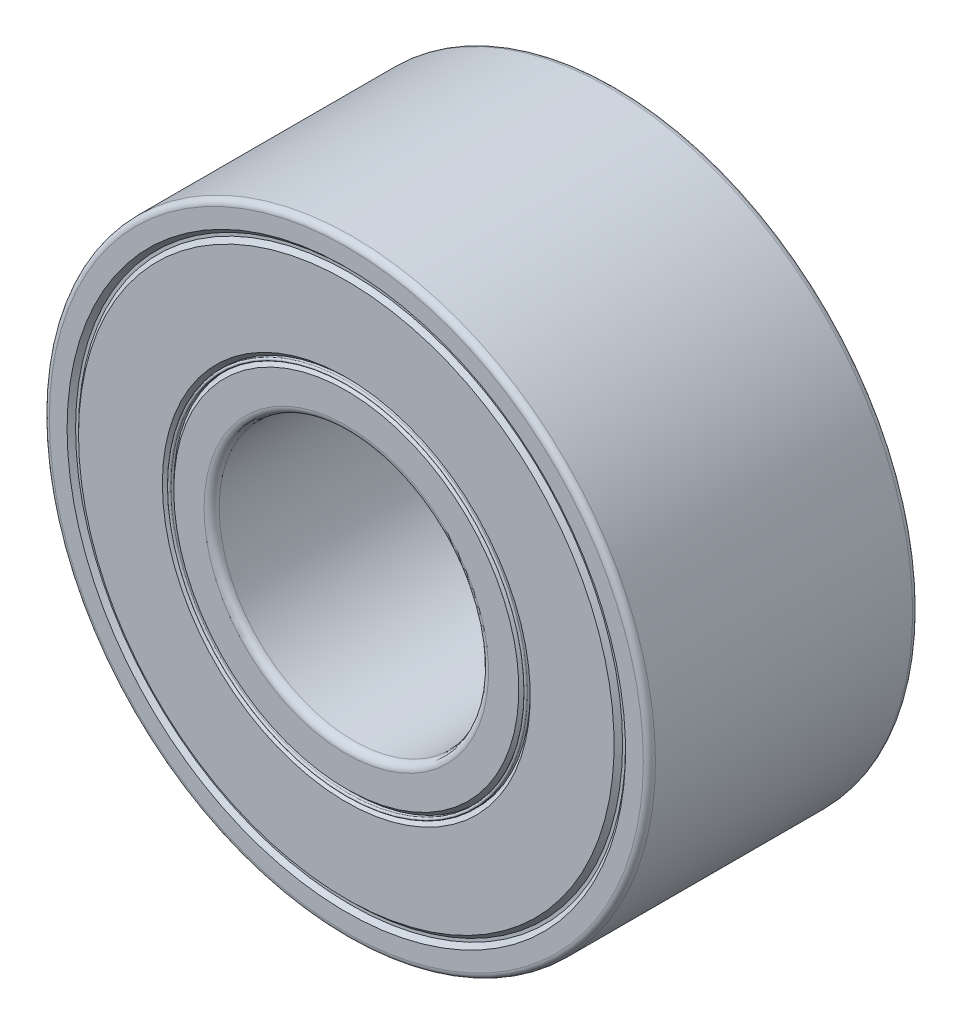
ISO-10303-21;
HEADER;
FILE_DESCRIPTION(('STEP AP214'),'2;1');
FILE_NAME('part.step','',(''),(''),'','','');
FILE_SCHEMA(('AUTOMOTIVE_DESIGN { 1 0 10303 214 1 1 1 1 }'));
ENDSEC;
DATA;
#1=APPLICATION_CONTEXT('core data for automotive mechanical design processes');
#2=APPLICATION_PROTOCOL_DEFINITION('international standard','automotive_design',2000,#1);
#3=PRODUCT_CONTEXT('',#1,'mechanical');
#4=PRODUCT('Part','Part','',(#3));
#5=PRODUCT_RELATED_PRODUCT_CATEGORY('part','',(#4));
#6=PRODUCT_DEFINITION_FORMATION('','',#4);
#7=PRODUCT_DEFINITION_CONTEXT('part definition',#1,'design');
#8=PRODUCT_DEFINITION('design','',#6,#7);
#9=PRODUCT_DEFINITION_SHAPE('','',#8);
#10=(LENGTH_UNIT() NAMED_UNIT(*) SI_UNIT(.MILLI.,.METRE.));
#11=(NAMED_UNIT(*) PLANE_ANGLE_UNIT() SI_UNIT($,.RADIAN.));
#12=(NAMED_UNIT(*) SI_UNIT($,.STERADIAN.) SOLID_ANGLE_UNIT());
#13=UNCERTAINTY_MEASURE_WITH_UNIT(LENGTH_MEASURE(1.E-05),#10,'distance_accuracy_value','');
#14=(GEOMETRIC_REPRESENTATION_CONTEXT(3) GLOBAL_UNCERTAINTY_ASSIGNED_CONTEXT((#13)) GLOBAL_UNIT_ASSIGNED_CONTEXT((#10,
#11,#12)) REPRESENTATION_CONTEXT('',''));
#15=CARTESIAN_POINT('',(0.,0.,0.));
#16=DIRECTION('',(0.,0.,1.));
#17=DIRECTION('',(1.,0.,0.));
#18=AXIS2_PLACEMENT_3D('',#15,#16,#17);
#19=CARTESIAN_POINT('',(0.,0.,-1.978125));
#20=DIRECTION('',(0.,0.,-1.));
#21=DIRECTION('',(-1.,0.,0.));
#22=AXIS2_PLACEMENT_3D('',#19,#20,#21);
#23=TOROIDAL_SURFACE('',#22,2.646875,0.0218749999999998);
#24=CARTESIAN_POINT('',(0.,0.,-1.978125));
#25=DIRECTION('',(0.,0.,-1.));
#26=DIRECTION('',(-1.,0.,0.));
#27=AXIS2_PLACEMENT_3D('',#24,#25,#26);
#28=CIRCLE('',#27,2.625);
#29=CARTESIAN_POINT('',(-2.625,0.,-1.978125));
#30=VERTEX_POINT('',#29);
#31=EDGE_CURVE('E62',#30,#30,#28,.T.);
#32=ORIENTED_EDGE('',*,*,#31,.F.);
#33=EDGE_LOOP('',(#32));
#34=FACE_BOUND('',#33,.T.);
#35=CARTESIAN_POINT('',(0.,0.,-1.978125));
#36=DIRECTION('',(0.,0.,-1.));
#37=DIRECTION('',(-1.,0.,0.));
#38=AXIS2_PLACEMENT_3D('',#35,#36,#37);
#39=CIRCLE('',#38,2.66875);
#40=CARTESIAN_POINT('',(-2.66875,0.,-1.978125));
#41=VERTEX_POINT('',#40);
#42=EDGE_CURVE('E11',#41,#41,#39,.T.);
#43=ORIENTED_EDGE('',*,*,#42,.T.);
#44=EDGE_LOOP('',(#43));
#45=FACE_BOUND('',#44,.T.);
#46=ADVANCED_FACE('F48',(#34,#45),#23,.T.);
#47=CARTESIAN_POINT('',(0.,0.,-2.));
#48=DIRECTION('',(0.,0.,-1.));
#49=DIRECTION('',(-1.,0.,0.));
#50=AXIS2_PLACEMENT_3D('',#47,#48,#49);
#51=CYLINDRICAL_SURFACE('',#50,2.66875);
#52=ORIENTED_EDGE('',*,*,#42,.F.);
#53=EDGE_LOOP('',(#52));
#54=FACE_BOUND('',#53,.T.);
#55=CARTESIAN_POINT('',(0.,0.,-1.937));
#56=DIRECTION('',(0.,0.,-1.));
#57=DIRECTION('',(-1.,0.,0.));
#58=AXIS2_PLACEMENT_3D('',#55,#56,#57);
#59=CIRCLE('',#58,2.66875);
#60=CARTESIAN_POINT('',(-2.66875,0.,-1.937));
#61=VERTEX_POINT('',#60);
#62=EDGE_CURVE('E54',#61,#61,#59,.T.);
#63=ORIENTED_EDGE('',*,*,#62,.T.);
#64=EDGE_LOOP('',(#63));
#65=FACE_BOUND('',#64,.T.);
#66=ADVANCED_FACE('F71',(#54,#65),#51,.T.);
#67=CARTESIAN_POINT('',(0.,-2.66875,-1.937));
#68=DIRECTION('',(0.,0.,-1.));
#69=DIRECTION('',(-1.,0.,0.));
#70=AXIS2_PLACEMENT_3D('',#67,#68,#69);
#71=PLANE('',#70);
#72=ORIENTED_EDGE('',*,*,#62,.F.);
#73=EDGE_LOOP('',(#72));
#74=FACE_BOUND('',#73,.T.);
#75=CARTESIAN_POINT('',(0.,0.,-1.937));
#76=DIRECTION('',(0.,0.,-1.));
#77=DIRECTION('',(-1.,0.,0.));
#78=AXIS2_PLACEMENT_3D('',#75,#76,#77);
#79=CIRCLE('',#78,2.625);
#80=CARTESIAN_POINT('',(-2.625,0.,-1.937));
#81=VERTEX_POINT('',#80);
#82=EDGE_CURVE('E58',#81,#81,#79,.T.);
#83=ORIENTED_EDGE('',*,*,#82,.T.);
#84=EDGE_LOOP('',(#83));
#85=FACE_BOUND('',#84,.T.);
#86=ADVANCED_FACE('F75',(#74,#85),#71,.F.);
#87=CARTESIAN_POINT('',(0.,0.,-2.));
#88=DIRECTION('',(0.,0.,-1.));
#89=DIRECTION('',(-1.,0.,0.));
#90=AXIS2_PLACEMENT_3D('',#87,#88,#89);
#91=CYLINDRICAL_SURFACE('',#90,2.625);
#92=ORIENTED_EDGE('',*,*,#82,.F.);
#93=EDGE_LOOP('',(#92));
#94=FACE_BOUND('',#93,.T.);
#95=ORIENTED_EDGE('',*,*,#31,.T.);
#96=EDGE_LOOP('',(#95));
#97=FACE_BOUND('',#96,.T.);
#98=ADVANCED_FACE('F68',(#94,#97),#91,.F.);
#99=CLOSED_SHELL('',(#46,#66,#86,#98));
#100=MANIFOLD_SOLID_BREP('B2',#99);
#101=CARTESIAN_POINT('',(0.,0.,-2.));
#102=DIRECTION('',(0.,0.,-1.));
#103=DIRECTION('',(-1.,0.,0.));
#104=AXIS2_PLACEMENT_3D('',#101,#102,#103);
#105=CYLINDRICAL_SURFACE('',#104,2.66875);
#106=CARTESIAN_POINT('',(0.,0.,1.937));
#107=DIRECTION('',(0.,0.,-1.));
#108=DIRECTION('',(-1.,0.,0.));
#109=AXIS2_PLACEMENT_3D('',#106,#107,#108);
#110=CIRCLE('',#109,2.66875);
#111=CARTESIAN_POINT('',(-2.66875,0.,1.937));
#112=VERTEX_POINT('',#111);
#113=EDGE_CURVE('E47',#112,#112,#110,.T.);
#114=ORIENTED_EDGE('',*,*,#113,.F.);
#115=EDGE_LOOP('',(#114));
#116=FACE_BOUND('',#115,.T.);
#117=CARTESIAN_POINT('',(0.,0.,1.978125));
#118=DIRECTION('',(0.,0.,-1.));
#119=DIRECTION('',(-1.,0.,0.));
#120=AXIS2_PLACEMENT_3D('',#117,#118,#119);
#121=CIRCLE('',#120,2.66875);
#122=CARTESIAN_POINT('',(-2.66875,0.,1.978125));
#123=VERTEX_POINT('',#122);
#124=EDGE_CURVE('E132',#123,#123,#121,.T.);
#125=ORIENTED_EDGE('',*,*,#124,.T.);
#126=EDGE_LOOP('',(#125));
#127=FACE_BOUND('',#126,.T.);
#128=ADVANCED_FACE('F118',(#116,#127),#105,.T.);
#129=CARTESIAN_POINT('',(0.,-2.66875,1.937));
#130=DIRECTION('',(0.,0.,1.));
#131=DIRECTION('',(1.,0.,0.));
#132=AXIS2_PLACEMENT_3D('',#129,#130,#131);
#133=PLANE('',#132);
#134=CARTESIAN_POINT('',(0.,0.,1.937));
#135=DIRECTION('',(0.,0.,-1.));
#136=DIRECTION('',(-1.,0.,0.));
#137=AXIS2_PLACEMENT_3D('',#134,#135,#136);
#138=CIRCLE('',#137,2.625);
#139=CARTESIAN_POINT('',(-2.625,0.,1.937));
#140=VERTEX_POINT('',#139);
#141=EDGE_CURVE('E124',#140,#140,#138,.T.);
#142=ORIENTED_EDGE('',*,*,#141,.F.);
#143=EDGE_LOOP('',(#142));
#144=FACE_BOUND('',#143,.T.);
#145=ORIENTED_EDGE('',*,*,#113,.T.);
#146=EDGE_LOOP('',(#145));
#147=FACE_BOUND('',#146,.T.);
#148=ADVANCED_FACE('F147',(#144,#147),#133,.F.);
#149=CARTESIAN_POINT('',(0.,0.,-2.));
#150=DIRECTION('',(0.,0.,-1.));
#151=DIRECTION('',(-1.,0.,0.));
#152=AXIS2_PLACEMENT_3D('',#149,#150,#151);
#153=CYLINDRICAL_SURFACE('',#152,2.625);
#154=CARTESIAN_POINT('',(0.,0.,1.978125));
#155=DIRECTION('',(0.,0.,-1.));
#156=DIRECTION('',(-1.,0.,0.));
#157=AXIS2_PLACEMENT_3D('',#154,#155,#156);
#158=CIRCLE('',#157,2.625);
#159=CARTESIAN_POINT('',(-2.625,0.,1.978125));
#160=VERTEX_POINT('',#159);
#161=EDGE_CURVE('E128',#160,#160,#158,.T.);
#162=ORIENTED_EDGE('',*,*,#161,.F.);
#163=EDGE_LOOP('',(#162));
#164=FACE_BOUND('',#163,.T.);
#165=ORIENTED_EDGE('',*,*,#141,.T.);
#166=EDGE_LOOP('',(#165));
#167=FACE_BOUND('',#166,.T.);
#168=ADVANCED_FACE('F142',(#164,#167),#153,.F.);
#169=CARTESIAN_POINT('',(0.,0.,1.978125));
#170=DIRECTION('',(0.,0.,-1.));
#171=DIRECTION('',(-1.,0.,0.));
#172=AXIS2_PLACEMENT_3D('',#169,#170,#171);
#173=TOROIDAL_SURFACE('',#172,2.646875,0.0218749999999998);
#174=ORIENTED_EDGE('',*,*,#124,.F.);
#175=EDGE_LOOP('',(#174));
#176=FACE_BOUND('',#175,.T.);
#177=ORIENTED_EDGE('',*,*,#161,.T.);
#178=EDGE_LOOP('',(#177));
#179=FACE_BOUND('',#178,.T.);
#180=ADVANCED_FACE('F139',(#176,#179),#173,.T.);
#181=CLOSED_SHELL('',(#128,#148,#168,#180));
#182=MANIFOLD_SOLID_BREP('B6',#181);
#183=CARTESIAN_POINT('',(0.,-4.03958333333333,-1.937));
#184=DIRECTION('',(0.,0.,1.));
#185=DIRECTION('',(1.,0.,0.));
#186=AXIS2_PLACEMENT_3D('',#183,#184,#185);
#187=PLANE('',#186);
#188=CARTESIAN_POINT('',(0.,0.,-1.937));
#189=DIRECTION('',(0.,0.,-1.));
#190=DIRECTION('',(-1.,0.,0.));
#191=AXIS2_PLACEMENT_3D('',#188,#189,#190);
#192=CIRCLE('',#191,4.03958333333333);
#193=CARTESIAN_POINT('',(-4.03958333333333,0.,-1.937));
#194=VERTEX_POINT('',#193);
#195=EDGE_CURVE('E216',#194,#194,#192,.T.);
#196=ORIENTED_EDGE('',*,*,#195,.F.);
#197=EDGE_LOOP('',(#196));
#198=FACE_BOUND('',#197,.T.);
#199=CARTESIAN_POINT('',(0.,0.,-1.937));
#200=DIRECTION('',(0.,0.,-1.));
#201=DIRECTION('',(-1.,0.,0.));
#202=AXIS2_PLACEMENT_3D('',#199,#200,#201);
#203=CIRCLE('',#202,4.08333333333333);
#204=CARTESIAN_POINT('',(-4.08333333333333,0.,-1.937));
#205=VERTEX_POINT('',#204);
#206=EDGE_CURVE('E117',#205,#205,#203,.T.);
#207=ORIENTED_EDGE('',*,*,#206,.T.);
#208=EDGE_LOOP('',(#207));
#209=FACE_BOUND('',#208,.T.);
#210=ADVANCED_FACE('F188',(#198,#209),#187,.F.);
#211=CARTESIAN_POINT('',(0.,0.,-2.));
#212=DIRECTION('',(0.,0.,-1.));
#213=DIRECTION('',(-1.,0.,0.));
#214=AXIS2_PLACEMENT_3D('',#211,#212,#213);
#215=CYLINDRICAL_SURFACE('',#214,4.08333333333333);
#216=ORIENTED_EDGE('',*,*,#206,.F.);
#217=EDGE_LOOP('',(#216));
#218=FACE_BOUND('',#217,.T.);
#219=CARTESIAN_POINT('',(0.,0.,-0.875000000000001));
#220=DIRECTION('',(0.,0.,-1.));
#221=DIRECTION('',(-1.,0.,0.));
#222=AXIS2_PLACEMENT_3D('',#219,#220,#221);
#223=CIRCLE('',#222,4.08333333333333);
#224=CARTESIAN_POINT('',(-4.08333333333333,0.,-0.875000000000001));
#225=VERTEX_POINT('',#224);
#226=EDGE_CURVE('E194',#225,#225,#223,.T.);
#227=ORIENTED_EDGE('',*,*,#226,.T.);
#228=EDGE_LOOP('',(#227));
#229=FACE_BOUND('',#228,.T.);
#230=ADVANCED_FACE('F223',(#218,#229),#215,.T.);
#231=CARTESIAN_POINT('',(0.,-4.08333333333333,-0.875000000000001));
#232=DIRECTION('',(0.,0.,-1.));
#233=DIRECTION('',(-1.,0.,0.));
#234=AXIS2_PLACEMENT_3D('',#231,#232,#233);
#235=PLANE('',#234);
#236=ORIENTED_EDGE('',*,*,#226,.F.);
#237=EDGE_LOOP('',(#236));
#238=FACE_BOUND('',#237,.T.);
#239=CARTESIAN_POINT('',(0.,0.,-0.875000000000001));
#240=DIRECTION('',(0.,0.,-1.));
#241=DIRECTION('',(-1.,0.,0.));
#242=AXIS2_PLACEMENT_3D('',#239,#240,#241);
#243=CIRCLE('',#242,2.625);
#244=CARTESIAN_POINT('',(-2.625,0.,-0.875000000000001));
#245=VERTEX_POINT('',#244);
#246=EDGE_CURVE('E198',#245,#245,#243,.T.);
#247=ORIENTED_EDGE('',*,*,#246,.T.);
#248=EDGE_LOOP('',(#247));
#249=FACE_BOUND('',#248,.T.);
#250=ADVANCED_FACE('F227',(#238,#249),#235,.F.);
#251=CARTESIAN_POINT('',(0.,0.,-2.));
#252=DIRECTION('',(0.,0.,-1.));
#253=DIRECTION('',(-1.,0.,0.));
#254=AXIS2_PLACEMENT_3D('',#251,#252,#253);
#255=CYLINDRICAL_SURFACE('',#254,2.625);
#256=ORIENTED_EDGE('',*,*,#246,.F.);
#257=EDGE_LOOP('',(#256));
#258=FACE_BOUND('',#257,.T.);
#259=CARTESIAN_POINT('',(0.,0.,-1.937));
#260=DIRECTION('',(0.,0.,-1.));
#261=DIRECTION('',(-1.,0.,0.));
#262=AXIS2_PLACEMENT_3D('',#259,#260,#261);
#263=CIRCLE('',#262,2.625);
#264=CARTESIAN_POINT('',(-2.625,0.,-1.937));
#265=VERTEX_POINT('',#264);
#266=EDGE_CURVE('E202',#265,#265,#263,.T.);
#267=ORIENTED_EDGE('',*,*,#266,.T.);
#268=EDGE_LOOP('',(#267));
#269=FACE_BOUND('',#268,.T.);
#270=ADVANCED_FACE('F232',(#258,#269),#255,.F.);
#271=CARTESIAN_POINT('',(0.,-2.66875,-1.937));
#272=DIRECTION('',(0.,0.,1.));
#273=DIRECTION('',(1.,0.,0.));
#274=AXIS2_PLACEMENT_3D('',#271,#272,#273);
#275=PLANE('',#274);
#276=ORIENTED_EDGE('',*,*,#266,.F.);
#277=EDGE_LOOP('',(#276));
#278=FACE_BOUND('',#277,.T.);
#279=CARTESIAN_POINT('',(0.,0.,-1.937));
#280=DIRECTION('',(0.,0.,-1.));
#281=DIRECTION('',(-1.,0.,0.));
#282=AXIS2_PLACEMENT_3D('',#279,#280,#281);
#283=CIRCLE('',#282,2.66875);
#284=CARTESIAN_POINT('',(-2.66875,0.,-1.937));
#285=VERTEX_POINT('',#284);
#286=EDGE_CURVE('E207',#285,#285,#283,.T.);
#287=ORIENTED_EDGE('',*,*,#286,.T.);
#288=EDGE_LOOP('',(#287));
#289=FACE_BOUND('',#288,.T.);
#290=ADVANCED_FACE('F238',(#278,#289),#275,.F.);
#291=CARTESIAN_POINT('',(0.,0.,-2.));
#292=DIRECTION('',(0.,0.,-1.));
#293=DIRECTION('',(-1.,0.,0.));
#294=AXIS2_PLACEMENT_3D('',#291,#292,#293);
#295=CONICAL_SURFACE('',#294,2.73175,0.785398163397465);
#296=ORIENTED_EDGE('',*,*,#286,.F.);
#297=EDGE_LOOP('',(#296));
#298=FACE_BOUND('',#297,.T.);
#299=CARTESIAN_POINT('',(0.,0.,-2.));
#300=DIRECTION('',(0.,0.,-1.));
#301=DIRECTION('',(-1.,0.,0.));
#302=AXIS2_PLACEMENT_3D('',#299,#300,#301);
#303=CIRCLE('',#302,2.73175);
#304=CARTESIAN_POINT('',(-2.73175,0.,-2.));
#305=VERTEX_POINT('',#304);
#306=EDGE_CURVE('E210',#305,#305,#303,.T.);
#307=ORIENTED_EDGE('',*,*,#306,.T.);
#308=EDGE_LOOP('',(#307));
#309=FACE_BOUND('',#308,.T.);
#310=ADVANCED_FACE('F242',(#298,#309),#295,.F.);
#311=CARTESIAN_POINT('',(0.,-2.73175,-2.));
#312=DIRECTION('',(0.,0.,1.));
#313=DIRECTION('',(1.,0.,0.));
#314=AXIS2_PLACEMENT_3D('',#311,#312,#313);
#315=PLANE('',#314);
#316=ORIENTED_EDGE('',*,*,#306,.F.);
#317=EDGE_LOOP('',(#316));
#318=FACE_BOUND('',#317,.T.);
#319=CARTESIAN_POINT('',(0.,0.,-2.));
#320=DIRECTION('',(0.,0.,-1.));
#321=DIRECTION('',(-1.,0.,0.));
#322=AXIS2_PLACEMENT_3D('',#319,#320,#321);
#323=CIRCLE('',#322,3.97658333333333);
#324=CARTESIAN_POINT('',(-3.97658333333333,0.,-2.));
#325=VERTEX_POINT('',#324);
#326=EDGE_CURVE('E213',#325,#325,#323,.T.);
#327=ORIENTED_EDGE('',*,*,#326,.T.);
#328=EDGE_LOOP('',(#327));
#329=FACE_BOUND('',#328,.T.);
#330=ADVANCED_FACE('F246',(#318,#329),#315,.F.);
#331=CARTESIAN_POINT('',(0.,0.,-1.937));
#332=DIRECTION('',(0.,0.,1.));
#333=DIRECTION('',(1.,0.,0.));
#334=AXIS2_PLACEMENT_3D('',#331,#332,#333);
#335=CONICAL_SURFACE('',#334,4.03958333333333,0.785398163397438);
#336=ORIENTED_EDGE('',*,*,#326,.F.);
#337=EDGE_LOOP('',(#336));
#338=FACE_BOUND('',#337,.T.);
#339=ORIENTED_EDGE('',*,*,#195,.T.);
#340=EDGE_LOOP('',(#339));
#341=FACE_BOUND('',#340,.T.);
#342=ADVANCED_FACE('F220',(#338,#341),#335,.T.);
#343=CLOSED_SHELL('',(#210,#230,#250,#270,#290,#310,#330,#342));
#344=MANIFOLD_SOLID_BREP('B42',#343);
#345=CARTESIAN_POINT('',(0.,0.,1.937));
#346=DIRECTION('',(0.,0.,1.));
#347=DIRECTION('',(1.,0.,0.));
#348=AXIS2_PLACEMENT_3D('',#345,#346,#347);
#349=CONICAL_SURFACE('',#348,2.66875,0.785398163397462);
#350=CARTESIAN_POINT('',(0.,0.,2.));
#351=DIRECTION('',(0.,0.,-1.));
#352=DIRECTION('',(-1.,0.,0.));
#353=AXIS2_PLACEMENT_3D('',#350,#351,#352);
#354=CIRCLE('',#353,2.73175);
#355=CARTESIAN_POINT('',(-2.73175,0.,2.));
#356=VERTEX_POINT('',#355);
#357=EDGE_CURVE('E344',#356,#356,#354,.T.);
#358=ORIENTED_EDGE('',*,*,#357,.F.);
#359=EDGE_LOOP('',(#358));
#360=FACE_BOUND('',#359,.T.);
#361=CARTESIAN_POINT('',(0.,0.,1.937));
#362=DIRECTION('',(0.,0.,-1.));
#363=DIRECTION('',(-1.,0.,0.));
#364=AXIS2_PLACEMENT_3D('',#361,#362,#363);
#365=CIRCLE('',#364,2.66875);
#366=CARTESIAN_POINT('',(-2.66875,0.,1.937));
#367=VERTEX_POINT('',#366);
#368=EDGE_CURVE('E187',#367,#367,#365,.T.);
#369=ORIENTED_EDGE('',*,*,#368,.T.);
#370=EDGE_LOOP('',(#369));
#371=FACE_BOUND('',#370,.T.);
#372=ADVANCED_FACE('F316',(#360,#371),#349,.F.);
#373=CARTESIAN_POINT('',(0.,-2.66875,1.937));
#374=DIRECTION('',(0.,0.,-1.));
#375=DIRECTION('',(-1.,0.,0.));
#376=AXIS2_PLACEMENT_3D('',#373,#374,#375);
#377=PLANE('',#376);
#378=ORIENTED_EDGE('',*,*,#368,.F.);
#379=EDGE_LOOP('',(#378));
#380=FACE_BOUND('',#379,.T.);
#381=CARTESIAN_POINT('',(0.,0.,1.937));
#382=DIRECTION('',(0.,0.,-1.));
#383=DIRECTION('',(-1.,0.,0.));
#384=AXIS2_PLACEMENT_3D('',#381,#382,#383);
#385=CIRCLE('',#384,2.625);
#386=CARTESIAN_POINT('',(-2.625,0.,1.937));
#387=VERTEX_POINT('',#386);
#388=EDGE_CURVE('E322',#387,#387,#385,.T.);
#389=ORIENTED_EDGE('',*,*,#388,.T.);
#390=EDGE_LOOP('',(#389));
#391=FACE_BOUND('',#390,.T.);
#392=ADVANCED_FACE('F351',(#380,#391),#377,.F.);
#393=CARTESIAN_POINT('',(0.,0.,-2.));
#394=DIRECTION('',(0.,0.,-1.));
#395=DIRECTION('',(-1.,0.,0.));
#396=AXIS2_PLACEMENT_3D('',#393,#394,#395);
#397=CYLINDRICAL_SURFACE('',#396,2.625);
#398=ORIENTED_EDGE('',*,*,#388,.F.);
#399=EDGE_LOOP('',(#398));
#400=FACE_BOUND('',#399,.T.);
#401=CARTESIAN_POINT('',(0.,0.,0.875000000000001));
#402=DIRECTION('',(0.,0.,-1.));
#403=DIRECTION('',(-1.,0.,0.));
#404=AXIS2_PLACEMENT_3D('',#401,#402,#403);
#405=CIRCLE('',#404,2.625);
#406=CARTESIAN_POINT('',(-2.625,0.,0.875000000000001));
#407=VERTEX_POINT('',#406);
#408=EDGE_CURVE('E326',#407,#407,#405,.T.);
#409=ORIENTED_EDGE('',*,*,#408,.T.);
#410=EDGE_LOOP('',(#409));
#411=FACE_BOUND('',#410,.T.);
#412=ADVANCED_FACE('F355',(#400,#411),#397,.F.);
#413=CARTESIAN_POINT('',(0.,-4.08333333333333,0.875000000000001));
#414=DIRECTION('',(0.,0.,1.));
#415=DIRECTION('',(1.,0.,0.));
#416=AXIS2_PLACEMENT_3D('',#413,#414,#415);
#417=PLANE('',#416);
#418=ORIENTED_EDGE('',*,*,#408,.F.);
#419=EDGE_LOOP('',(#418));
#420=FACE_BOUND('',#419,.T.);
#421=CARTESIAN_POINT('',(0.,0.,0.875000000000001));
#422=DIRECTION('',(0.,0.,-1.));
#423=DIRECTION('',(-1.,0.,0.));
#424=AXIS2_PLACEMENT_3D('',#421,#422,#423);
#425=CIRCLE('',#424,4.08333333333333);
#426=CARTESIAN_POINT('',(-4.08333333333333,0.,0.875000000000001));
#427=VERTEX_POINT('',#426);
#428=EDGE_CURVE('E330',#427,#427,#425,.T.);
#429=ORIENTED_EDGE('',*,*,#428,.T.);
#430=EDGE_LOOP('',(#429));
#431=FACE_BOUND('',#430,.T.);
#432=ADVANCED_FACE('F360',(#420,#431),#417,.F.);
#433=CARTESIAN_POINT('',(0.,0.,-2.));
#434=DIRECTION('',(0.,0.,-1.));
#435=DIRECTION('',(-1.,0.,0.));
#436=AXIS2_PLACEMENT_3D('',#433,#434,#435);
#437=CYLINDRICAL_SURFACE('',#436,4.08333333333333);
#438=ORIENTED_EDGE('',*,*,#428,.F.);
#439=EDGE_LOOP('',(#438));
#440=FACE_BOUND('',#439,.T.);
#441=CARTESIAN_POINT('',(0.,0.,1.937));
#442=DIRECTION('',(0.,0.,-1.));
#443=DIRECTION('',(-1.,0.,0.));
#444=AXIS2_PLACEMENT_3D('',#441,#442,#443);
#445=CIRCLE('',#444,4.08333333333333);
#446=CARTESIAN_POINT('',(-4.08333333333333,0.,1.937));
#447=VERTEX_POINT('',#446);
#448=EDGE_CURVE('E335',#447,#447,#445,.T.);
#449=ORIENTED_EDGE('',*,*,#448,.T.);
#450=EDGE_LOOP('',(#449));
#451=FACE_BOUND('',#450,.T.);
#452=ADVANCED_FACE('F366',(#440,#451),#437,.T.);
#453=CARTESIAN_POINT('',(0.,-4.03958333333333,1.937));
#454=DIRECTION('',(0.,0.,-1.));
#455=DIRECTION('',(-1.,0.,0.));
#456=AXIS2_PLACEMENT_3D('',#453,#454,#455);
#457=PLANE('',#456);
#458=ORIENTED_EDGE('',*,*,#448,.F.);
#459=EDGE_LOOP('',(#458));
#460=FACE_BOUND('',#459,.T.);
#461=CARTESIAN_POINT('',(0.,0.,1.937));
#462=DIRECTION('',(0.,0.,-1.));
#463=DIRECTION('',(-1.,0.,0.));
#464=AXIS2_PLACEMENT_3D('',#461,#462,#463);
#465=CIRCLE('',#464,4.03958333333333);
#466=CARTESIAN_POINT('',(-4.03958333333333,0.,1.937));
#467=VERTEX_POINT('',#466);
#468=EDGE_CURVE('E338',#467,#467,#465,.T.);
#469=ORIENTED_EDGE('',*,*,#468,.T.);
#470=EDGE_LOOP('',(#469));
#471=FACE_BOUND('',#470,.T.);
#472=ADVANCED_FACE('F370',(#460,#471),#457,.F.);
#473=CARTESIAN_POINT('',(0.,0.,2.));
#474=DIRECTION('',(0.,0.,-1.));
#475=DIRECTION('',(-1.,0.,0.));
#476=AXIS2_PLACEMENT_3D('',#473,#474,#475);
#477=CONICAL_SURFACE('',#476,3.97658333333333,0.785398163397435);
#478=ORIENTED_EDGE('',*,*,#468,.F.);
#479=EDGE_LOOP('',(#478));
#480=FACE_BOUND('',#479,.T.);
#481=CARTESIAN_POINT('',(0.,0.,2.));
#482=DIRECTION('',(0.,0.,-1.));
#483=DIRECTION('',(-1.,0.,0.));
#484=AXIS2_PLACEMENT_3D('',#481,#482,#483);
#485=CIRCLE('',#484,3.97658333333333);
#486=CARTESIAN_POINT('',(-3.97658333333333,0.,2.));
#487=VERTEX_POINT('',#486);
#488=EDGE_CURVE('E341',#487,#487,#485,.T.);
#489=ORIENTED_EDGE('',*,*,#488,.T.);
#490=EDGE_LOOP('',(#489));
#491=FACE_BOUND('',#490,.T.);
#492=ADVANCED_FACE('F374',(#480,#491),#477,.T.);
#493=CARTESIAN_POINT('',(0.,-2.73175,2.));
#494=DIRECTION('',(0.,0.,-1.));
#495=DIRECTION('',(-1.,0.,0.));
#496=AXIS2_PLACEMENT_3D('',#493,#494,#495);
#497=PLANE('',#496);
#498=ORIENTED_EDGE('',*,*,#488,.F.);
#499=EDGE_LOOP('',(#498));
#500=FACE_BOUND('',#499,.T.);
#501=ORIENTED_EDGE('',*,*,#357,.T.);
#502=EDGE_LOOP('',(#501));
#503=FACE_BOUND('',#502,.T.);
#504=ADVANCED_FACE('F348',(#500,#503),#497,.F.);
#505=CLOSED_SHELL('',(#372,#392,#412,#432,#452,#472,#492,#504));
#506=MANIFOLD_SOLID_BREP('B112',#505);
#507=CARTESIAN_POINT('',(2.1560167741569,-2.56944073629493,0.));
#508=DIRECTION('',(-0.64278760968653,0.766044443118986,0.));
#509=DIRECTION('',(0.,0.,-1.));
#510=AXIS2_PLACEMENT_3D('',#507,#508,#509);
#511=SPHERICAL_SURFACE('',#510,0.875000000000001);
#512=CARTESIAN_POINT('',(1.59357761568119,-1.89915184856582,0.));
#513=VERTEX_POINT('',#512);
#514=VERTEX_LOOP('',#513);
#515=FACE_BOUND('',#514,.T.);
#516=ADVANCED_FACE('F444',(#515),#511,.T.);
#517=CLOSED_SHELL('',(#516));
#518=MANIFOLD_SOLID_BREP('B182',#517);
#519=CARTESIAN_POINT('',(3.30320933822844,-0.582444929257863,0.));
#520=DIRECTION('',(-0.984807753012206,0.17364817766694,0.));
#521=DIRECTION('',(0.,0.,-1.));
#522=AXIS2_PLACEMENT_3D('',#519,#520,#521);
#523=SPHERICAL_SURFACE('',#522,0.875000000000001);
#524=CARTESIAN_POINT('',(2.44150255434276,-0.43050277379929,0.));
#525=VERTEX_POINT('',#524);
#526=VERTEX_LOOP('',#525);
#527=FACE_BOUND('',#526,.T.);
#528=ADVANCED_FACE('F463',(#527),#523,.T.);
#529=CLOSED_SHELL('',(#528));
#530=MANIFOLD_SOLID_BREP('B312',#529);
#531=CARTESIAN_POINT('',(2.90479354186032,1.67708333333331,0.));
#532=DIRECTION('',(-0.866025403784443,-0.499999999999992,0.));
#533=DIRECTION('',(0.,0.,-1.));
#534=AXIS2_PLACEMENT_3D('',#531,#532,#533);
#535=SPHERICAL_SURFACE('',#534,0.875000000000001);
#536=CARTESIAN_POINT('',(2.14702131354893,1.23958333333331,0.));
#537=VERTEX_POINT('',#536);
#538=VERTEX_LOOP('',#537);
#539=FACE_BOUND('',#538,.T.);
#540=ADVANCED_FACE('F482',(#539),#535,.T.);
#541=CLOSED_SHELL('',(#540));
#542=MANIFOLD_SOLID_BREP('B440',#541);
#543=CARTESIAN_POINT('',(1.14719256407154,3.15188566555273,0.));
#544=DIRECTION('',(-0.342020143325676,-0.939692620785906,0.));
#545=DIRECTION('',(0.,0.,-1.));
#546=AXIS2_PLACEMENT_3D('',#543,#544,#545);
#547=SPHERICAL_SURFACE('',#546,0.875000000000001);
#548=CARTESIAN_POINT('',(0.847924938661571,2.32965462236506,0.));
#549=VERTEX_POINT('',#548);
#550=VERTEX_LOOP('',#549);
#551=FACE_BOUND('',#550,.T.);
#552=ADVANCED_FACE('F501',(#551),#547,.T.);
#553=CLOSED_SHELL('',(#552));
#554=MANIFOLD_SOLID_BREP('B459',#553);
#555=CARTESIAN_POINT('',(-1.1471925640715,3.15188566555274,0.));
#556=DIRECTION('',(0.342020143325663,-0.939692620785911,0.));
#557=DIRECTION('',(0.,0.,-1.));
#558=AXIS2_PLACEMENT_3D('',#555,#556,#557);
#559=SPHERICAL_SURFACE('',#558,0.875000000000001);
#560=CARTESIAN_POINT('',(-0.84792493866154,2.32965462236507,0.));
#561=VERTEX_POINT('',#560);
#562=VERTEX_LOOP('',#561);
#563=FACE_BOUND('',#562,.T.);
#564=ADVANCED_FACE('F520',(#563),#559,.T.);
#565=CLOSED_SHELL('',(#564));
#566=MANIFOLD_SOLID_BREP('B478',#565);
#567=CARTESIAN_POINT('',(-2.9047935418603,1.67708333333335,0.));
#568=DIRECTION('',(0.866025403784436,-0.500000000000004,0.));
#569=DIRECTION('',(0.,0.,-1.));
#570=AXIS2_PLACEMENT_3D('',#567,#568,#569);
#571=SPHERICAL_SURFACE('',#570,0.875000000000001);
#572=CARTESIAN_POINT('',(-2.14702131354891,1.23958333333334,0.));
#573=VERTEX_POINT('',#572);
#574=VERTEX_LOOP('',#573);
#575=FACE_BOUND('',#574,.T.);
#576=ADVANCED_FACE('F539',(#575),#571,.T.);
#577=CLOSED_SHELL('',(#576));
#578=MANIFOLD_SOLID_BREP('B497',#577);
#579=CARTESIAN_POINT('',(-3.30320933822845,-0.582444929257819,0.));
#580=DIRECTION('',(0.984807753012209,0.173648177666927,0.));
#581=DIRECTION('',(0.,0.,-1.));
#582=AXIS2_PLACEMENT_3D('',#579,#580,#581);
#583=SPHERICAL_SURFACE('',#582,0.875000000000001);
#584=CARTESIAN_POINT('',(-2.44150255434277,-0.430502773799257,0.));
#585=VERTEX_POINT('',#584);
#586=VERTEX_LOOP('',#585);
#587=FACE_BOUND('',#586,.T.);
#588=ADVANCED_FACE('F558',(#587),#583,.T.);
#589=CLOSED_SHELL('',(#588));
#590=MANIFOLD_SOLID_BREP('B516',#589);
#591=CARTESIAN_POINT('',(-2.15601677415694,-2.5694407362949,0.));
#592=DIRECTION('',(0.642787609686541,0.766044443118977,0.));
#593=DIRECTION('',(0.,0.,-1.));
#594=AXIS2_PLACEMENT_3D('',#591,#592,#593);
#595=SPHERICAL_SURFACE('',#594,0.875000000000001);
#596=CARTESIAN_POINT('',(-1.59357761568121,-1.8991518485658,0.));
#597=VERTEX_POINT('',#596);
#598=VERTEX_LOOP('',#597);
#599=FACE_BOUND('',#598,.T.);
#600=ADVANCED_FACE('F577',(#599),#595,.T.);
#601=CLOSED_SHELL('',(#600));
#602=MANIFOLD_SOLID_BREP('B535',#601);
#603=CARTESIAN_POINT('',(0.,-3.35416666666667,0.));
#604=DIRECTION('',(0.,1.,0.));
#605=DIRECTION('',(0.,0.,-1.));
#606=AXIS2_PLACEMENT_3D('',#603,#604,#605);
#607=SPHERICAL_SURFACE('',#606,0.875000000000001);
#608=CARTESIAN_POINT('',(0.,-2.47916666666667,0.));
#609=VERTEX_POINT('',#608);
#610=VERTEX_LOOP('',#609);
#611=FACE_BOUND('',#610,.T.);
#612=ADVANCED_FACE('F598',(#611),#607,.T.);
#613=CLOSED_SHELL('',(#612));
#614=MANIFOLD_SOLID_BREP('B554',#613);
#615=CARTESIAN_POINT('',(0.,0.,-2.));
#616=DIRECTION('',(0.,0.,-1.));
#617=DIRECTION('',(-1.,0.,0.));
#618=AXIS2_PLACEMENT_3D('',#615,#616,#617);
#619=CYLINDRICAL_SURFACE('',#618,2.625);
#620=CARTESIAN_POINT('',(0.,0.,-1.937));
#621=DIRECTION('',(0.,0.,1.));
#622=DIRECTION('',(1.,0.,0.));
#623=AXIS2_PLACEMENT_3D('',#620,#621,#622);
#624=CIRCLE('',#623,2.625);
#625=CARTESIAN_POINT('',(2.625,0.,-1.937));
#626=VERTEX_POINT('',#625);
#627=EDGE_CURVE('E629',#626,#626,#624,.T.);
#628=ORIENTED_EDGE('',*,*,#627,.T.);
#629=EDGE_LOOP('',(#628));
#630=FACE_BOUND('',#629,.T.);
#631=CARTESIAN_POINT('',(0.,0.,-0.483674448593496));
#632=DIRECTION('',(0.,0.,1.));
#633=DIRECTION('',(1.,0.,0.));
#634=AXIS2_PLACEMENT_3D('',#631,#632,#633);
#635=CIRCLE('',#634,2.625);
#636=CARTESIAN_POINT('',(2.625,0.,-0.483674448593496));
#637=VERTEX_POINT('',#636);
#638=EDGE_CURVE('E650',#637,#637,#635,.T.);
#639=ORIENTED_EDGE('',*,*,#638,.F.);
#640=EDGE_LOOP('',(#639));
#641=FACE_BOUND('',#640,.T.);
#642=ADVANCED_FACE('F618',(#630,#641),#619,.T.);
#643=CARTESIAN_POINT('',(0.,0.,1.937));
#644=DIRECTION('',(0.,0.,-1.));
#645=DIRECTION('',(-1.,0.,0.));
#646=AXIS2_PLACEMENT_3D('',#643,#644,#645);
#647=CIRCLE('',#646,2.625);
#648=CARTESIAN_POINT('',(-2.625,0.,1.937));
#649=VERTEX_POINT('',#648);
#650=EDGE_CURVE('E625',#649,#649,#647,.T.);
#651=ORIENTED_EDGE('',*,*,#650,.T.);
#652=EDGE_LOOP('',(#651));
#653=FACE_BOUND('',#652,.T.);
#654=CARTESIAN_POINT('',(0.,0.,0.483674448593496));
#655=DIRECTION('',(0.,0.,-1.));
#656=DIRECTION('',(-1.,0.,0.));
#657=AXIS2_PLACEMENT_3D('',#654,#655,#656);
#658=CIRCLE('',#657,2.625);
#659=CARTESIAN_POINT('',(-2.625,0.,0.483674448593496));
#660=VERTEX_POINT('',#659);
#661=EDGE_CURVE('E653',#660,#660,#658,.T.);
#662=ORIENTED_EDGE('',*,*,#661,.F.);
#663=EDGE_LOOP('',(#662));
#664=FACE_BOUND('',#663,.T.);
#665=ADVANCED_FACE('F660',(#653,#664),#619,.T.);
#666=CARTESIAN_POINT('',(0.,-2.625,2.));
#667=DIRECTION('',(0.,0.,-1.));
#668=DIRECTION('',(-1.,0.,0.));
#669=AXIS2_PLACEMENT_3D('',#666,#667,#668);
#670=PLANE('',#669);
#671=CARTESIAN_POINT('',(0.,0.,2.));
#672=DIRECTION('',(0.,0.,-1.));
#673=DIRECTION('',(-1.,0.,0.));
#674=AXIS2_PLACEMENT_3D('',#671,#672,#673);
#675=CIRCLE('',#674,2.562);
#676=CARTESIAN_POINT('',(-2.562,0.,2.));
#677=VERTEX_POINT('',#676);
#678=EDGE_CURVE('E597',#677,#677,#675,.F.);
#679=ORIENTED_EDGE('',*,*,#678,.T.);
#680=EDGE_LOOP('',(#679));
#681=FACE_BOUND('',#680,.T.);
#682=CARTESIAN_POINT('',(0.,0.,2.));
#683=DIRECTION('',(0.,0.,-1.));
#684=DIRECTION('',(-1.,0.,0.));
#685=AXIS2_PLACEMENT_3D('',#682,#683,#684);
#686=CIRCLE('',#685,2.1125);
#687=CARTESIAN_POINT('',(-2.1125,0.,2.));
#688=VERTEX_POINT('',#687);
#689=EDGE_CURVE('E638',#688,#688,#686,.T.);
#690=ORIENTED_EDGE('',*,*,#689,.T.);
#691=EDGE_LOOP('',(#690));
#692=FACE_BOUND('',#691,.T.);
#693=ADVANCED_FACE('F662',(#681,#692),#670,.F.);
#694=CARTESIAN_POINT('',(0.,0.,-2.));
#695=DIRECTION('',(0.,0.,-1.));
#696=DIRECTION('',(-1.,0.,0.));
#697=AXIS2_PLACEMENT_3D('',#694,#695,#696);
#698=CYLINDRICAL_SURFACE('',#697,2.);
#699=CARTESIAN_POINT('',(0.,0.,-1.8875));
#700=DIRECTION('',(0.,0.,1.));
#701=DIRECTION('',(1.,0.,0.));
#702=AXIS2_PLACEMENT_3D('',#699,#700,#701);
#703=CIRCLE('',#702,2.);
#704=CARTESIAN_POINT('',(2.,0.,-1.8875));
#705=VERTEX_POINT('',#704);
#706=EDGE_CURVE('E644',#705,#705,#703,.F.);
#707=ORIENTED_EDGE('',*,*,#706,.T.);
#708=EDGE_LOOP('',(#707));
#709=FACE_BOUND('',#708,.T.);
#710=CARTESIAN_POINT('',(0.,0.,1.8875));
#711=DIRECTION('',(0.,0.,-1.));
#712=DIRECTION('',(-1.,0.,0.));
#713=AXIS2_PLACEMENT_3D('',#710,#711,#712);
#714=CIRCLE('',#713,2.);
#715=CARTESIAN_POINT('',(-2.,0.,1.8875));
#716=VERTEX_POINT('',#715);
#717=EDGE_CURVE('E647',#716,#716,#714,.F.);
#718=ORIENTED_EDGE('',*,*,#717,.T.);
#719=EDGE_LOOP('',(#718));
#720=FACE_BOUND('',#719,.T.);
#721=ADVANCED_FACE('F668',(#709,#720),#698,.F.);
#722=CARTESIAN_POINT('',(0.,-2.625,-2.));
#723=DIRECTION('',(0.,0.,1.));
#724=DIRECTION('',(1.,0.,0.));
#725=AXIS2_PLACEMENT_3D('',#722,#723,#724);
#726=PLANE('',#725);
#727=CARTESIAN_POINT('',(0.,0.,-2.));
#728=DIRECTION('',(0.,0.,1.));
#729=DIRECTION('',(1.,0.,0.));
#730=AXIS2_PLACEMENT_3D('',#727,#728,#729);
#731=CIRCLE('',#730,2.562);
#732=CARTESIAN_POINT('',(2.562,0.,-2.));
#733=VERTEX_POINT('',#732);
#734=EDGE_CURVE('E633',#733,#733,#731,.F.);
#735=ORIENTED_EDGE('',*,*,#734,.T.);
#736=EDGE_LOOP('',(#735));
#737=FACE_BOUND('',#736,.T.);
#738=CARTESIAN_POINT('',(0.,0.,-2.));
#739=DIRECTION('',(0.,0.,1.));
#740=DIRECTION('',(1.,0.,0.));
#741=AXIS2_PLACEMENT_3D('',#738,#739,#740);
#742=CIRCLE('',#741,2.1125);
#743=CARTESIAN_POINT('',(2.1125,0.,-2.));
#744=VERTEX_POINT('',#743);
#745=EDGE_CURVE('E641',#744,#744,#742,.T.);
#746=ORIENTED_EDGE('',*,*,#745,.T.);
#747=EDGE_LOOP('',(#746));
#748=FACE_BOUND('',#747,.T.);
#749=ADVANCED_FACE('F673',(#737,#748),#726,.F.);
#750=CARTESIAN_POINT('',(0.,0.,0.));
#751=DIRECTION('',(0.,0.,-1.));
#752=DIRECTION('',(-1.,0.,0.));
#753=AXIS2_PLACEMENT_3D('',#750,#751,#752);
#754=TOROIDAL_SURFACE('',#753,3.35416666666667,0.875000000000001);
#755=ORIENTED_EDGE('',*,*,#661,.T.);
#756=EDGE_LOOP('',(#755));
#757=FACE_BOUND('',#756,.T.);
#758=ORIENTED_EDGE('',*,*,#638,.T.);
#759=EDGE_LOOP('',(#758));
#760=FACE_BOUND('',#759,.T.);
#761=ADVANCED_FACE('F657',(#757,#760),#754,.F.);
#762=CARTESIAN_POINT('',(0.,0.,-1.8875));
#763=DIRECTION('',(0.,0.,1.));
#764=DIRECTION('',(1.,0.,0.));
#765=AXIS2_PLACEMENT_3D('',#762,#763,#764);
#766=TOROIDAL_SURFACE('',#765,2.1125,0.1125);
#767=ORIENTED_EDGE('',*,*,#745,.F.);
#768=EDGE_LOOP('',(#767));
#769=FACE_BOUND('',#768,.T.);
#770=ORIENTED_EDGE('',*,*,#706,.F.);
#771=EDGE_LOOP('',(#770));
#772=FACE_BOUND('',#771,.T.);
#773=ADVANCED_FACE('F680',(#769,#772),#766,.T.);
#774=CARTESIAN_POINT('',(0.,0.,1.8875));
#775=DIRECTION('',(0.,0.,-1.));
#776=DIRECTION('',(-1.,0.,0.));
#777=AXIS2_PLACEMENT_3D('',#774,#775,#776);
#778=TOROIDAL_SURFACE('',#777,2.1125,0.1125);
#779=ORIENTED_EDGE('',*,*,#717,.F.);
#780=EDGE_LOOP('',(#779));
#781=FACE_BOUND('',#780,.T.);
#782=ORIENTED_EDGE('',*,*,#689,.F.);
#783=EDGE_LOOP('',(#782));
#784=FACE_BOUND('',#783,.T.);
#785=ADVANCED_FACE('F683',(#781,#784),#778,.T.);
#786=CARTESIAN_POINT('',(0.,0.,-2.));
#787=DIRECTION('',(0.,0.,1.));
#788=DIRECTION('',(1.,0.,0.));
#789=AXIS2_PLACEMENT_3D('',#786,#787,#788);
#790=CONICAL_SURFACE('',#789,2.562,0.785398163397443);
#791=ORIENTED_EDGE('',*,*,#627,.F.);
#792=EDGE_LOOP('',(#791));
#793=FACE_BOUND('',#792,.T.);
#794=ORIENTED_EDGE('',*,*,#734,.F.);
#795=EDGE_LOOP('',(#794));
#796=FACE_BOUND('',#795,.T.);
#797=ADVANCED_FACE('F686',(#793,#796),#790,.T.);
#798=CARTESIAN_POINT('',(0.,0.,1.937));
#799=DIRECTION('',(0.,0.,-1.));
#800=DIRECTION('',(-1.,0.,0.));
#801=AXIS2_PLACEMENT_3D('',#798,#799,#800);
#802=CONICAL_SURFACE('',#801,2.625,0.785398163397452);
#803=ORIENTED_EDGE('',*,*,#678,.F.);
#804=EDGE_LOOP('',(#803));
#805=FACE_BOUND('',#804,.T.);
#806=ORIENTED_EDGE('',*,*,#650,.F.);
#807=EDGE_LOOP('',(#806));
#808=FACE_BOUND('',#807,.T.);
#809=ADVANCED_FACE('F620',(#805,#808),#802,.T.);
#810=CLOSED_SHELL('',(#642,#665,#693,#721,#749,#761,#773,#785,#797,#809));
#811=MANIFOLD_SOLID_BREP('B573',#810);
#812=CARTESIAN_POINT('',(0.,0.,-2.));
#813=DIRECTION('',(0.,0.,-1.));
#814=DIRECTION('',(-1.,0.,0.));
#815=AXIS2_PLACEMENT_3D('',#812,#813,#814);
#816=CYLINDRICAL_SURFACE('',#815,4.08333333333333);
#817=CARTESIAN_POINT('',(0.,0.,-1.937));
#818=DIRECTION('',(0.,0.,1.));
#819=DIRECTION('',(1.,0.,0.));
#820=AXIS2_PLACEMENT_3D('',#817,#818,#819);
#821=CIRCLE('',#820,4.08333333333333);
#822=CARTESIAN_POINT('',(4.08333333333333,0.,-1.937));
#823=VERTEX_POINT('',#822);
#824=EDGE_CURVE('E784',#823,#823,#821,.F.);
#825=ORIENTED_EDGE('',*,*,#824,.T.);
#826=EDGE_LOOP('',(#825));
#827=FACE_BOUND('',#826,.T.);
#828=CARTESIAN_POINT('',(0.,0.,-0.483674448593495));
#829=DIRECTION('',(0.,0.,1.));
#830=DIRECTION('',(1.,0.,0.));
#831=AXIS2_PLACEMENT_3D('',#828,#829,#830);
#832=CIRCLE('',#831,4.08333333333333);
#833=CARTESIAN_POINT('',(4.08333333333333,0.,-0.483674448593495));
#834=VERTEX_POINT('',#833);
#835=EDGE_CURVE('E801',#834,#834,#832,.F.);
#836=ORIENTED_EDGE('',*,*,#835,.F.);
#837=EDGE_LOOP('',(#836));
#838=FACE_BOUND('',#837,.T.);
#839=ADVANCED_FACE('F769',(#827,#838),#816,.F.);
#840=CARTESIAN_POINT('',(0.,0.,1.937));
#841=DIRECTION('',(0.,0.,-1.));
#842=DIRECTION('',(-1.,0.,0.));
#843=AXIS2_PLACEMENT_3D('',#840,#841,#842);
#844=CIRCLE('',#843,4.08333333333333);
#845=CARTESIAN_POINT('',(-4.08333333333333,0.,1.937));
#846=VERTEX_POINT('',#845);
#847=EDGE_CURVE('E617',#846,#846,#844,.F.);
#848=ORIENTED_EDGE('',*,*,#847,.T.);
#849=EDGE_LOOP('',(#848));
#850=FACE_BOUND('',#849,.T.);
#851=CARTESIAN_POINT('',(0.,0.,0.483674448593495));
#852=DIRECTION('',(0.,0.,-1.));
#853=DIRECTION('',(-1.,0.,0.));
#854=AXIS2_PLACEMENT_3D('',#851,#852,#853);
#855=CIRCLE('',#854,4.08333333333333);
#856=CARTESIAN_POINT('',(-4.08333333333333,0.,0.483674448593495));
#857=VERTEX_POINT('',#856);
#858=EDGE_CURVE('E804',#857,#857,#855,.F.);
#859=ORIENTED_EDGE('',*,*,#858,.F.);
#860=EDGE_LOOP('',(#859));
#861=FACE_BOUND('',#860,.T.);
#862=ADVANCED_FACE('F811',(#850,#861),#816,.F.);
#863=CARTESIAN_POINT('',(0.,-4.08333333333333,2.));
#864=DIRECTION('',(0.,0.,-1.));
#865=DIRECTION('',(-1.,0.,0.));
#866=AXIS2_PLACEMENT_3D('',#863,#864,#865);
#867=PLANE('',#866);
#868=CARTESIAN_POINT('',(0.,0.,2.));
#869=DIRECTION('',(0.,0.,-1.));
#870=DIRECTION('',(-1.,0.,0.));
#871=AXIS2_PLACEMENT_3D('',#868,#869,#870);
#872=CIRCLE('',#871,4.14633333333333);
#873=CARTESIAN_POINT('',(-4.14633333333333,0.,2.));
#874=VERTEX_POINT('',#873);
#875=EDGE_CURVE('E776',#874,#874,#872,.T.);
#876=ORIENTED_EDGE('',*,*,#875,.T.);
#877=EDGE_LOOP('',(#876));
#878=FACE_BOUND('',#877,.T.);
#879=CARTESIAN_POINT('',(0.,0.,2.));
#880=DIRECTION('',(0.,0.,-1.));
#881=DIRECTION('',(-1.,0.,0.));
#882=AXIS2_PLACEMENT_3D('',#879,#880,#881);
#883=CIRCLE('',#882,4.41);
#884=CARTESIAN_POINT('',(-4.41,0.,2.));
#885=VERTEX_POINT('',#884);
#886=EDGE_CURVE('E789',#885,#885,#883,.F.);
#887=ORIENTED_EDGE('',*,*,#886,.T.);
#888=EDGE_LOOP('',(#887));
#889=FACE_BOUND('',#888,.T.);
#890=ADVANCED_FACE('F813',(#878,#889),#867,.F.);
#891=CARTESIAN_POINT('',(0.,0.,-2.));
#892=DIRECTION('',(0.,0.,-1.));
#893=DIRECTION('',(-1.,0.,0.));
#894=AXIS2_PLACEMENT_3D('',#891,#892,#893);
#895=CYLINDRICAL_SURFACE('',#894,4.5);
#896=CARTESIAN_POINT('',(0.,0.,-1.91));
#897=DIRECTION('',(0.,0.,1.));
#898=DIRECTION('',(1.,0.,0.));
#899=AXIS2_PLACEMENT_3D('',#896,#897,#898);
#900=CIRCLE('',#899,4.5);
#901=CARTESIAN_POINT('',(4.5,0.,-1.91));
#902=VERTEX_POINT('',#901);
#903=EDGE_CURVE('E792',#902,#902,#900,.T.);
#904=ORIENTED_EDGE('',*,*,#903,.T.);
#905=EDGE_LOOP('',(#904));
#906=FACE_BOUND('',#905,.T.);
#907=CARTESIAN_POINT('',(0.,0.,1.91));
#908=DIRECTION('',(0.,0.,-1.));
#909=DIRECTION('',(-1.,0.,0.));
#910=AXIS2_PLACEMENT_3D('',#907,#908,#909);
#911=CIRCLE('',#910,4.5);
#912=CARTESIAN_POINT('',(-4.5,0.,1.91));
#913=VERTEX_POINT('',#912);
#914=EDGE_CURVE('E795',#913,#913,#911,.T.);
#915=ORIENTED_EDGE('',*,*,#914,.T.);
#916=EDGE_LOOP('',(#915));
#917=FACE_BOUND('',#916,.T.);
#918=ADVANCED_FACE('F819',(#906,#917),#895,.T.);
#919=CARTESIAN_POINT('',(0.,-4.5,-2.));
#920=DIRECTION('',(0.,0.,1.));
#921=DIRECTION('',(1.,0.,0.));
#922=AXIS2_PLACEMENT_3D('',#919,#920,#921);
#923=PLANE('',#922);
#924=CARTESIAN_POINT('',(0.,0.,-2.));
#925=DIRECTION('',(0.,0.,1.));
#926=DIRECTION('',(1.,0.,0.));
#927=AXIS2_PLACEMENT_3D('',#924,#925,#926);
#928=CIRCLE('',#927,4.14633333333334);
#929=CARTESIAN_POINT('',(4.14633333333334,0.,-2.));
#930=VERTEX_POINT('',#929);
#931=EDGE_CURVE('E780',#930,#930,#928,.T.);
#932=ORIENTED_EDGE('',*,*,#931,.T.);
#933=EDGE_LOOP('',(#932));
#934=FACE_BOUND('',#933,.T.);
#935=CARTESIAN_POINT('',(0.,0.,-2.));
#936=DIRECTION('',(0.,0.,1.));
#937=DIRECTION('',(1.,0.,0.));
#938=AXIS2_PLACEMENT_3D('',#935,#936,#937);
#939=CIRCLE('',#938,4.41);
#940=CARTESIAN_POINT('',(4.41,0.,-2.));
#941=VERTEX_POINT('',#940);
#942=EDGE_CURVE('E798',#941,#941,#939,.F.);
#943=ORIENTED_EDGE('',*,*,#942,.T.);
#944=EDGE_LOOP('',(#943));
#945=FACE_BOUND('',#944,.T.);
#946=ADVANCED_FACE('F824',(#934,#945),#923,.F.);
#947=CARTESIAN_POINT('',(0.,0.,0.));
#948=DIRECTION('',(0.,0.,-1.));
#949=DIRECTION('',(-1.,0.,0.));
#950=AXIS2_PLACEMENT_3D('',#947,#948,#949);
#951=TOROIDAL_SURFACE('',#950,3.35416666666667,0.875000000000001);
#952=ORIENTED_EDGE('',*,*,#858,.T.);
#953=EDGE_LOOP('',(#952));
#954=FACE_BOUND('',#953,.T.);
#955=ORIENTED_EDGE('',*,*,#835,.T.);
#956=EDGE_LOOP('',(#955));
#957=FACE_BOUND('',#956,.T.);
#958=ADVANCED_FACE('F808',(#954,#957),#951,.F.);
#959=CARTESIAN_POINT('',(0.,0.,-1.91));
#960=DIRECTION('',(0.,0.,1.));
#961=DIRECTION('',(1.,0.,0.));
#962=AXIS2_PLACEMENT_3D('',#959,#960,#961);
#963=TOROIDAL_SURFACE('',#962,4.41,0.09);
#964=ORIENTED_EDGE('',*,*,#903,.F.);
#965=EDGE_LOOP('',(#964));
#966=FACE_BOUND('',#965,.T.);
#967=ORIENTED_EDGE('',*,*,#942,.F.);
#968=EDGE_LOOP('',(#967));
#969=FACE_BOUND('',#968,.T.);
#970=ADVANCED_FACE('F831',(#966,#969),#963,.T.);
#971=CARTESIAN_POINT('',(0.,0.,1.91));
#972=DIRECTION('',(0.,0.,-1.));
#973=DIRECTION('',(-1.,0.,0.));
#974=AXIS2_PLACEMENT_3D('',#971,#972,#973);
#975=TOROIDAL_SURFACE('',#974,4.41,0.09);
#976=ORIENTED_EDGE('',*,*,#886,.F.);
#977=EDGE_LOOP('',(#976));
#978=FACE_BOUND('',#977,.T.);
#979=ORIENTED_EDGE('',*,*,#914,.F.);
#980=EDGE_LOOP('',(#979));
#981=FACE_BOUND('',#980,.T.);
#982=ADVANCED_FACE('F834',(#978,#981),#975,.T.);
#983=CARTESIAN_POINT('',(0.,0.,-1.937));
#984=DIRECTION('',(0.,0.,-1.));
#985=DIRECTION('',(-1.,0.,0.));
#986=AXIS2_PLACEMENT_3D('',#983,#984,#985);
#987=CONICAL_SURFACE('',#986,4.08333333333333,0.785398163397455);
#988=ORIENTED_EDGE('',*,*,#931,.F.);
#989=EDGE_LOOP('',(#988));
#990=FACE_BOUND('',#989,.T.);
#991=ORIENTED_EDGE('',*,*,#824,.F.);
#992=EDGE_LOOP('',(#991));
#993=FACE_BOUND('',#992,.T.);
#994=ADVANCED_FACE('F837',(#990,#993),#987,.F.);
#995=CARTESIAN_POINT('',(0.,0.,2.));
#996=DIRECTION('',(0.,0.,1.));
#997=DIRECTION('',(1.,0.,0.));
#998=AXIS2_PLACEMENT_3D('',#995,#996,#997);
#999=CONICAL_SURFACE('',#998,4.14633333333333,0.785398163397441);
#1000=ORIENTED_EDGE('',*,*,#847,.F.);
#1001=EDGE_LOOP('',(#1000));
#1002=FACE_BOUND('',#1001,.T.);
#1003=ORIENTED_EDGE('',*,*,#875,.F.);
#1004=EDGE_LOOP('',(#1003));
#1005=FACE_BOUND('',#1004,.T.);
#1006=ADVANCED_FACE('F771',(#1002,#1005),#999,.F.);
#1007=CLOSED_SHELL('',(#839,#862,#890,#918,#946,#958,#970,#982,#994,#1006));
#1008=MANIFOLD_SOLID_BREP('B592',#1007);
#1009=ADVANCED_BREP_SHAPE_REPRESENTATION('',(#18,#100,#182,#344,#506,#518,#530,#542,#554,#566,
#578,#590,#602,#614,#811,#1008),#14);
#1010=SHAPE_DEFINITION_REPRESENTATION(#9,#1009);
ENDSEC;
END-ISO-10303-21;
